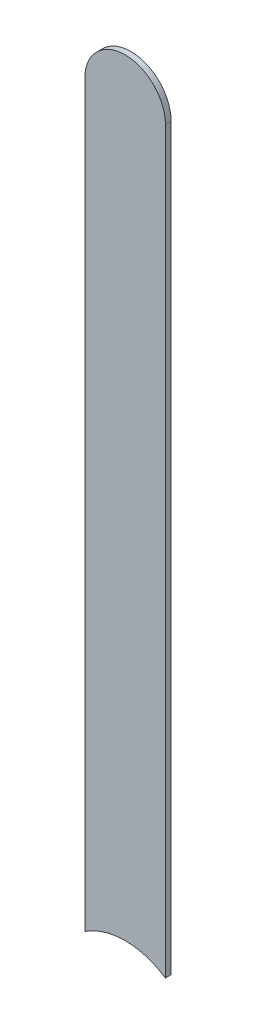
ISO-10303-21;
HEADER;
FILE_DESCRIPTION(('STEP AP214'),'2;1');
FILE_NAME('part.step','',(''),(''),'','','');
FILE_SCHEMA(('AUTOMOTIVE_DESIGN { 1 0 10303 214 1 1 1 1 }'));
ENDSEC;
DATA;
#1=APPLICATION_CONTEXT('core data for automotive mechanical design processes');
#2=APPLICATION_PROTOCOL_DEFINITION('international standard','automotive_design',2000,#1);
#3=PRODUCT_CONTEXT('',#1,'mechanical');
#4=PRODUCT('Part','Part','',(#3));
#5=PRODUCT_RELATED_PRODUCT_CATEGORY('part','',(#4));
#6=PRODUCT_DEFINITION_FORMATION('','',#4);
#7=PRODUCT_DEFINITION_CONTEXT('part definition',#1,'design');
#8=PRODUCT_DEFINITION('design','',#6,#7);
#9=PRODUCT_DEFINITION_SHAPE('','',#8);
#10=(LENGTH_UNIT() NAMED_UNIT(*) SI_UNIT(.MILLI.,.METRE.));
#11=(NAMED_UNIT(*) PLANE_ANGLE_UNIT() SI_UNIT($,.RADIAN.));
#12=(NAMED_UNIT(*) SI_UNIT($,.STERADIAN.) SOLID_ANGLE_UNIT());
#13=UNCERTAINTY_MEASURE_WITH_UNIT(LENGTH_MEASURE(1.E-05),#10,'distance_accuracy_value','');
#14=(GEOMETRIC_REPRESENTATION_CONTEXT(3) GLOBAL_UNCERTAINTY_ASSIGNED_CONTEXT((#13)) GLOBAL_UNIT_ASSIGNED_CONTEXT((#10,
#11,#12)) REPRESENTATION_CONTEXT('',''));
#15=CARTESIAN_POINT('',(0.,0.,0.));
#16=DIRECTION('',(0.,0.,1.));
#17=DIRECTION('',(1.,0.,0.));
#18=AXIS2_PLACEMENT_3D('',#15,#16,#17);
#19=CARTESIAN_POINT('',(34.15000028,101.414166110346,0.));
#20=DIRECTION('',(-1.,0.,0.));
#21=DIRECTION('',(0.,1.,0.));
#22=AXIS2_PLACEMENT_3D('',#19,#20,#21);
#23=PLANE('',#22);
#24=DIRECTION('',(0.,1.,0.));
#25=VECTOR('',#24,1.);
#26=CARTESIAN_POINT('',(34.15000028,101.0247408,0.03556));
#27=LINE('',#26,#25);
#28=CARTESIAN_POINT('',(34.15000028,101.414166110346,0.03556));
#29=VERTEX_POINT('',#28);
#30=CARTESIAN_POINT('',(34.15000028,106.00000136,0.03556));
#31=VERTEX_POINT('',#30);
#32=EDGE_CURVE('E11',#29,#31,#27,.T.);
#33=ORIENTED_EDGE('',*,*,#32,.F.);
#34=DIRECTION('',(0.,0.,1.));
#35=VECTOR('',#34,1.);
#36=CARTESIAN_POINT('',(34.15000028,101.414166110346,0.));
#37=LINE('',#36,#35);
#38=CARTESIAN_POINT('',(34.15000028,101.414166110346,0.));
#39=VERTEX_POINT('',#38);
#40=EDGE_CURVE('E24',#39,#29,#37,.T.);
#41=ORIENTED_EDGE('',*,*,#40,.F.);
#42=DIRECTION('',(0.,1.,0.));
#43=VECTOR('',#42,1.);
#44=CARTESIAN_POINT('',(34.15000028,101.0247408,0.));
#45=LINE('',#44,#43);
#46=CARTESIAN_POINT('',(34.15000028,106.00000136,0.));
#47=VERTEX_POINT('',#46);
#48=EDGE_CURVE('E75',#39,#47,#45,.T.);
#49=ORIENTED_EDGE('',*,*,#48,.T.);
#50=DIRECTION('',(0.,0.,1.));
#51=VECTOR('',#50,1.);
#52=CARTESIAN_POINT('',(34.15000028,106.00000136,0.));
#53=LINE('',#52,#51);
#54=EDGE_CURVE('E37',#47,#31,#53,.T.);
#55=ORIENTED_EDGE('',*,*,#54,.T.);
#56=EDGE_LOOP('',(#33,#41,#49,#55));
#57=FACE_BOUND('',#56,.T.);
#58=ADVANCED_FACE('F17',(#57),#23,.F.);
#59=CARTESIAN_POINT('',(33.90000078,106.00000136,0.));
#60=DIRECTION('',(0.,0.,-1.));
#61=DIRECTION('',(1.,0.,0.));
#62=AXIS2_PLACEMENT_3D('',#59,#60,#61);
#63=CYLINDRICAL_SURFACE('',#62,0.249999499999999);
#64=CARTESIAN_POINT('',(33.90000078,106.00000136,0.03556));
#65=DIRECTION('',(0.,0.,1.));
#66=DIRECTION('',(1.,0.,0.));
#67=AXIS2_PLACEMENT_3D('',#64,#65,#66);
#68=CIRCLE('',#67,0.249999499999999);
#69=CARTESIAN_POINT('',(33.65000128,106.00000136,0.03556));
#70=VERTEX_POINT('',#69);
#71=EDGE_CURVE('E83',#31,#70,#68,.T.);
#72=ORIENTED_EDGE('',*,*,#71,.F.);
#73=ORIENTED_EDGE('',*,*,#54,.F.);
#74=CARTESIAN_POINT('',(33.90000078,106.00000136,0.));
#75=DIRECTION('',(0.,0.,1.));
#76=DIRECTION('',(1.,0.,0.));
#77=AXIS2_PLACEMENT_3D('',#74,#75,#76);
#78=CIRCLE('',#77,0.249999499999999);
#79=CARTESIAN_POINT('',(33.65000128,106.00000136,0.));
#80=VERTEX_POINT('',#79);
#81=EDGE_CURVE('E81',#47,#80,#78,.T.);
#82=ORIENTED_EDGE('',*,*,#81,.T.);
#83=DIRECTION('',(0.,0.,1.));
#84=VECTOR('',#83,1.);
#85=CARTESIAN_POINT('',(33.65000128,106.00000136,0.));
#86=LINE('',#85,#84);
#87=EDGE_CURVE('E67',#80,#70,#86,.T.);
#88=ORIENTED_EDGE('',*,*,#87,.T.);
#89=EDGE_LOOP('',(#72,#73,#82,#88));
#90=FACE_BOUND('',#89,.T.);
#91=ADVANCED_FACE('F89',(#90),#63,.T.);
#92=CARTESIAN_POINT('',(33.65000128,106.00000136,0.));
#93=DIRECTION('',(1.,0.,0.));
#94=DIRECTION('',(0.,-1.,0.));
#95=AXIS2_PLACEMENT_3D('',#92,#93,#94);
#96=PLANE('',#95);
#97=DIRECTION('',(0.,-1.,0.));
#98=VECTOR('',#97,1.);
#99=CARTESIAN_POINT('',(33.65000128,106.00000136,0.03556));
#100=LINE('',#99,#98);
#101=CARTESIAN_POINT('',(33.65000128,101.414166110346,0.03556));
#102=VERTEX_POINT('',#101);
#103=EDGE_CURVE('E71',#70,#102,#100,.T.);
#104=ORIENTED_EDGE('',*,*,#103,.F.);
#105=ORIENTED_EDGE('',*,*,#87,.F.);
#106=DIRECTION('',(0.,-1.,0.));
#107=VECTOR('',#106,1.);
#108=CARTESIAN_POINT('',(33.65000128,106.00000136,0.));
#109=LINE('',#108,#107);
#110=CARTESIAN_POINT('',(33.65000128,101.414166110346,0.));
#111=VERTEX_POINT('',#110);
#112=EDGE_CURVE('E63',#80,#111,#109,.T.);
#113=ORIENTED_EDGE('',*,*,#112,.T.);
#114=DIRECTION('',(0.,0.,1.));
#115=VECTOR('',#114,1.);
#116=CARTESIAN_POINT('',(33.65000128,101.414166110346,0.));
#117=LINE('',#116,#115);
#118=EDGE_CURVE('E53',#111,#102,#117,.T.);
#119=ORIENTED_EDGE('',*,*,#118,.T.);
#120=EDGE_LOOP('',(#104,#105,#113,#119));
#121=FACE_BOUND('',#120,.T.);
#122=ADVANCED_FACE('F66',(#121),#96,.F.);
#123=CARTESIAN_POINT('',(33.90000078,101.04000112,0.));
#124=DIRECTION('',(0.,0.,-1.));
#125=DIRECTION('',(1.,0.,0.));
#126=AXIS2_PLACEMENT_3D('',#123,#124,#125);
#127=CYLINDRICAL_SURFACE('',#126,0.4499991);
#128=ORIENTED_EDGE('',*,*,#40,.T.);
#129=CARTESIAN_POINT('',(33.90000078,101.04000112,0.03556));
#130=DIRECTION('',(0.,0.,1.));
#131=DIRECTION('',(1.,0.,0.));
#132=AXIS2_PLACEMENT_3D('',#129,#130,#131);
#133=CIRCLE('',#132,0.4499991);
#134=EDGE_CURVE('E59',#29,#102,#133,.T.);
#135=ORIENTED_EDGE('',*,*,#134,.T.);
#136=ORIENTED_EDGE('',*,*,#118,.F.);
#137=CARTESIAN_POINT('',(33.90000078,101.04000112,0.));
#138=DIRECTION('',(0.,0.,1.));
#139=DIRECTION('',(1.,0.,0.));
#140=AXIS2_PLACEMENT_3D('',#137,#138,#139);
#141=CIRCLE('',#140,0.4499991);
#142=EDGE_CURVE('E57',#39,#111,#141,.T.);
#143=ORIENTED_EDGE('',*,*,#142,.F.);
#144=EDGE_LOOP('',(#128,#135,#136,#143));
#145=FACE_BOUND('',#144,.T.);
#146=ADVANCED_FACE('F55',(#145),#127,.F.);
#147=CARTESIAN_POINT('',(34.15000028,101.0247408,0.));
#148=DIRECTION('',(0.,0.,-1.));
#149=DIRECTION('',(-1.,0.,0.));
#150=AXIS2_PLACEMENT_3D('',#147,#148,#149);
#151=PLANE('',#150);
#152=ORIENTED_EDGE('',*,*,#48,.F.);
#153=ORIENTED_EDGE('',*,*,#142,.T.);
#154=ORIENTED_EDGE('',*,*,#112,.F.);
#155=ORIENTED_EDGE('',*,*,#81,.F.);
#156=EDGE_LOOP('',(#152,#153,#154,#155));
#157=FACE_BOUND('',#156,.T.);
#158=ADVANCED_FACE('F74',(#157),#151,.T.);
#159=CARTESIAN_POINT('',(34.15000028,101.0247408,0.03556));
#160=DIRECTION('',(0.,0.,-1.));
#161=DIRECTION('',(-1.,0.,0.));
#162=AXIS2_PLACEMENT_3D('',#159,#160,#161);
#163=PLANE('',#162);
#164=ORIENTED_EDGE('',*,*,#134,.F.);
#165=ORIENTED_EDGE('',*,*,#32,.T.);
#166=ORIENTED_EDGE('',*,*,#71,.T.);
#167=ORIENTED_EDGE('',*,*,#103,.T.);
#168=EDGE_LOOP('',(#164,#165,#166,#167));
#169=FACE_BOUND('',#168,.T.);
#170=ADVANCED_FACE('F91',(#169),#163,.F.);
#171=CLOSED_SHELL('',(#58,#91,#122,#146,#158,#170));
#172=MANIFOLD_SOLID_BREP('B1',#171);
#173=ADVANCED_BREP_SHAPE_REPRESENTATION('',(#18,#172),#14);
#174=SHAPE_DEFINITION_REPRESENTATION(#9,#173);
ENDSEC;
END-ISO-10303-21;
